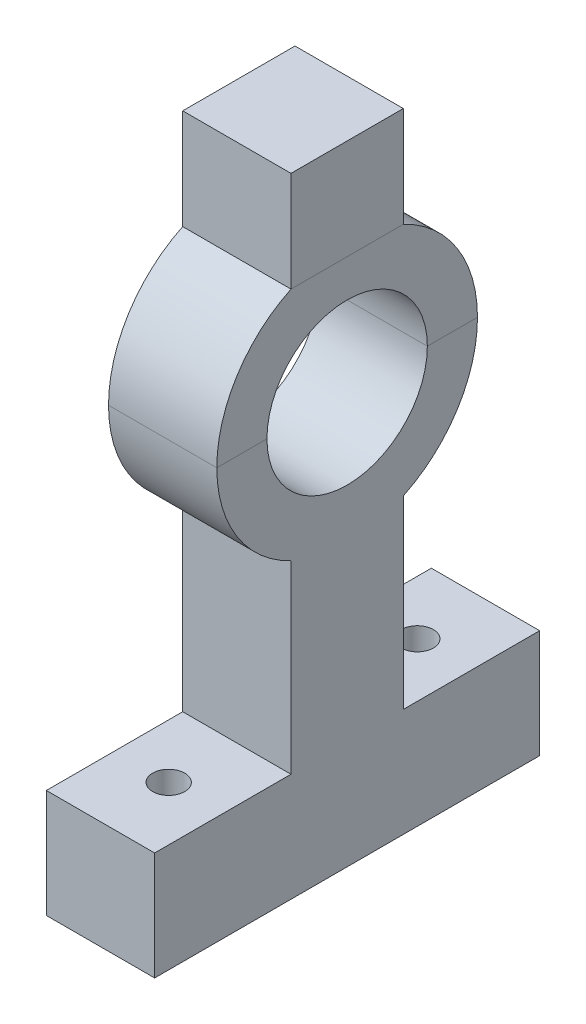
ISO-10303-21;
HEADER;
FILE_DESCRIPTION(('STEP AP214'),'2;1');
FILE_NAME('part.step','',(''),(''),'','','');
FILE_SCHEMA(('AUTOMOTIVE_DESIGN { 1 0 10303 214 1 1 1 1 }'));
ENDSEC;
DATA;
#1=APPLICATION_CONTEXT('core data for automotive mechanical design processes');
#2=APPLICATION_PROTOCOL_DEFINITION('international standard','automotive_design',2000,#1);
#3=PRODUCT_CONTEXT('',#1,'mechanical');
#4=PRODUCT('Part','Part','',(#3));
#5=PRODUCT_RELATED_PRODUCT_CATEGORY('part','',(#4));
#6=PRODUCT_DEFINITION_FORMATION('','',#4);
#7=PRODUCT_DEFINITION_CONTEXT('part definition',#1,'design');
#8=PRODUCT_DEFINITION('design','',#6,#7);
#9=PRODUCT_DEFINITION_SHAPE('','',#8);
#10=(LENGTH_UNIT() NAMED_UNIT(*) SI_UNIT(.MILLI.,.METRE.));
#11=(NAMED_UNIT(*) PLANE_ANGLE_UNIT() SI_UNIT($,.RADIAN.));
#12=(NAMED_UNIT(*) SI_UNIT($,.STERADIAN.) SOLID_ANGLE_UNIT());
#13=UNCERTAINTY_MEASURE_WITH_UNIT(LENGTH_MEASURE(1.E-05),#10,'distance_accuracy_value','');
#14=(GEOMETRIC_REPRESENTATION_CONTEXT(3) GLOBAL_UNCERTAINTY_ASSIGNED_CONTEXT((#13)) GLOBAL_UNIT_ASSIGNED_CONTEXT((#10,
#11,#12)) REPRESENTATION_CONTEXT('',''));
#15=CARTESIAN_POINT('',(0.,0.,0.));
#16=DIRECTION('',(0.,0.,1.));
#17=DIRECTION('',(1.,0.,0.));
#18=AXIS2_PLACEMENT_3D('',#15,#16,#17);
#19=CARTESIAN_POINT('',(27.,95.2100375042499,0.));
#20=DIRECTION('',(0.,1.,0.));
#21=DIRECTION('',(0.,0.,1.));
#22=AXIS2_PLACEMENT_3D('',#19,#20,#21);
#23=PLANE('',#22);
#24=DIRECTION('',(0.,0.,-1.));
#25=VECTOR('',#24,1.);
#26=CARTESIAN_POINT('',(0.,95.2100375042499,0.));
#27=LINE('',#26,#25);
#28=CARTESIAN_POINT('',(0.,95.2100375042499,14.));
#29=VERTEX_POINT('',#28);
#30=CARTESIAN_POINT('',(0.,95.2100375042499,-14.));
#31=VERTEX_POINT('',#30);
#32=EDGE_CURVE('E110',#29,#31,#27,.T.);
#33=ORIENTED_EDGE('',*,*,#32,.T.);
#34=DIRECTION('',(-1.,0.,0.));
#35=VECTOR('',#34,1.);
#36=CARTESIAN_POINT('',(27.,95.2100375042499,-14.));
#37=LINE('',#36,#35);
#38=CARTESIAN_POINT('',(27.,95.2100375042499,-14.));
#39=VERTEX_POINT('',#38);
#40=EDGE_CURVE('E13',#39,#31,#37,.T.);
#41=ORIENTED_EDGE('',*,*,#40,.F.);
#42=DIRECTION('',(0.,0.,-1.));
#43=VECTOR('',#42,1.);
#44=CARTESIAN_POINT('',(27.,95.2100375042499,0.));
#45=LINE('',#44,#43);
#46=CARTESIAN_POINT('',(27.,95.2100375042499,14.));
#47=VERTEX_POINT('',#46);
#48=EDGE_CURVE('E96',#47,#39,#45,.T.);
#49=ORIENTED_EDGE('',*,*,#48,.F.);
#50=DIRECTION('',(-1.,0.,0.));
#51=VECTOR('',#50,1.);
#52=CARTESIAN_POINT('',(27.,95.2100375042499,14.));
#53=LINE('',#52,#51);
#54=EDGE_CURVE('E63',#47,#29,#53,.T.);
#55=ORIENTED_EDGE('',*,*,#54,.T.);
#56=EDGE_LOOP('',(#33,#41,#49,#55));
#57=FACE_BOUND('',#56,.T.);
#58=ADVANCED_FACE('F47',(#57),#23,.F.);
#59=CARTESIAN_POINT('',(27.,0.,-14.));
#60=DIRECTION('',(0.,0.,1.));
#61=DIRECTION('',(0.,-1.,0.));
#62=AXIS2_PLACEMENT_3D('',#59,#60,#61);
#63=PLANE('',#62);
#64=DIRECTION('',(0.,1.,0.));
#65=VECTOR('',#64,1.);
#66=CARTESIAN_POINT('',(0.,0.,-14.));
#67=LINE('',#66,#65);
#68=CARTESIAN_POINT('',(0.,120.21003750425,-14.));
#69=VERTEX_POINT('',#68);
#70=EDGE_CURVE('E101',#31,#69,#67,.T.);
#71=ORIENTED_EDGE('',*,*,#70,.T.);
#72=DIRECTION('',(-1.,0.,0.));
#73=VECTOR('',#72,1.);
#74=CARTESIAN_POINT('',(27.,120.21003750425,-14.));
#75=LINE('',#74,#73);
#76=CARTESIAN_POINT('',(27.,120.21003750425,-14.));
#77=VERTEX_POINT('',#76);
#78=EDGE_CURVE('E55',#77,#69,#75,.T.);
#79=ORIENTED_EDGE('',*,*,#78,.F.);
#80=DIRECTION('',(0.,1.,0.));
#81=VECTOR('',#80,1.);
#82=CARTESIAN_POINT('',(27.,0.,-14.));
#83=LINE('',#82,#81);
#84=EDGE_CURVE('E88',#39,#77,#83,.T.);
#85=ORIENTED_EDGE('',*,*,#84,.F.);
#86=ORIENTED_EDGE('',*,*,#40,.T.);
#87=EDGE_LOOP('',(#71,#79,#85,#86));
#88=FACE_BOUND('',#87,.T.);
#89=ADVANCED_FACE('F100',(#88),#63,.F.);
#90=CARTESIAN_POINT('',(27.,120.21003750425,0.));
#91=DIRECTION('',(0.,1.,0.));
#92=DIRECTION('',(0.,0.,1.));
#93=AXIS2_PLACEMENT_3D('',#90,#91,#92);
#94=PLANE('',#93);
#95=DIRECTION('',(0.,0.,-1.));
#96=VECTOR('',#95,1.);
#97=CARTESIAN_POINT('',(0.,120.21003750425,0.));
#98=LINE('',#97,#96);
#99=CARTESIAN_POINT('',(0.,120.21003750425,14.));
#100=VERTEX_POINT('',#99);
#101=EDGE_CURVE('E113',#100,#69,#98,.T.);
#102=ORIENTED_EDGE('',*,*,#101,.F.);
#103=DIRECTION('',(-1.,0.,0.));
#104=VECTOR('',#103,1.);
#105=CARTESIAN_POINT('',(27.,120.21003750425,14.));
#106=LINE('',#105,#104);
#107=CARTESIAN_POINT('',(27.,120.21003750425,14.));
#108=VERTEX_POINT('',#107);
#109=EDGE_CURVE('E77',#108,#100,#106,.T.);
#110=ORIENTED_EDGE('',*,*,#109,.F.);
#111=DIRECTION('',(0.,0.,-1.));
#112=VECTOR('',#111,1.);
#113=CARTESIAN_POINT('',(27.,120.21003750425,0.));
#114=LINE('',#113,#112);
#115=EDGE_CURVE('E95',#108,#77,#114,.T.);
#116=ORIENTED_EDGE('',*,*,#115,.T.);
#117=ORIENTED_EDGE('',*,*,#78,.T.);
#118=EDGE_LOOP('',(#102,#110,#116,#117));
#119=FACE_BOUND('',#118,.T.);
#120=ADVANCED_FACE('F104',(#119),#94,.T.);
#121=CARTESIAN_POINT('',(27.,0.,14.));
#122=DIRECTION('',(0.,0.,1.));
#123=DIRECTION('',(0.,-1.,0.));
#124=AXIS2_PLACEMENT_3D('',#121,#122,#123);
#125=PLANE('',#124);
#126=DIRECTION('',(0.,1.,0.));
#127=VECTOR('',#126,1.);
#128=CARTESIAN_POINT('',(0.,0.,14.));
#129=LINE('',#128,#127);
#130=EDGE_CURVE('E115',#29,#100,#129,.T.);
#131=ORIENTED_EDGE('',*,*,#130,.F.);
#132=ORIENTED_EDGE('',*,*,#54,.F.);
#133=DIRECTION('',(0.,1.,0.));
#134=VECTOR('',#133,1.);
#135=CARTESIAN_POINT('',(27.,0.,14.));
#136=LINE('',#135,#134);
#137=EDGE_CURVE('E105',#47,#108,#136,.T.);
#138=ORIENTED_EDGE('',*,*,#137,.T.);
#139=ORIENTED_EDGE('',*,*,#109,.T.);
#140=EDGE_LOOP('',(#131,#132,#138,#139));
#141=FACE_BOUND('',#140,.T.);
#142=ADVANCED_FACE('F121',(#141),#125,.T.);
#143=CARTESIAN_POINT('',(27.,0.,0.));
#144=DIRECTION('',(1.,0.,0.));
#145=DIRECTION('',(0.,0.,-1.));
#146=AXIS2_PLACEMENT_3D('',#143,#144,#145);
#147=PLANE('',#146);
#148=ORIENTED_EDGE('',*,*,#48,.T.);
#149=ORIENTED_EDGE('',*,*,#84,.T.);
#150=ORIENTED_EDGE('',*,*,#115,.F.);
#151=ORIENTED_EDGE('',*,*,#137,.F.);
#152=EDGE_LOOP('',(#148,#149,#150,#151));
#153=FACE_BOUND('',#152,.T.);
#154=ADVANCED_FACE('F92',(#153),#147,.T.);
#155=CARTESIAN_POINT('',(0.,0.,0.));
#156=DIRECTION('',(1.,0.,0.));
#157=DIRECTION('',(0.,0.,-1.));
#158=AXIS2_PLACEMENT_3D('',#155,#156,#157);
#159=PLANE('',#158);
#160=ORIENTED_EDGE('',*,*,#32,.F.);
#161=ORIENTED_EDGE('',*,*,#130,.T.);
#162=ORIENTED_EDGE('',*,*,#101,.T.);
#163=ORIENTED_EDGE('',*,*,#70,.F.);
#164=EDGE_LOOP('',(#160,#161,#162,#163));
#165=FACE_BOUND('',#164,.T.);
#166=ADVANCED_FACE('F120',(#165),#159,.F.);
#167=CLOSED_SHELL('',(#58,#89,#120,#142,#154,#166));
#168=MANIFOLD_SOLID_BREP('B2',#167);
#169=CARTESIAN_POINT('',(27.,95.2100375042499,0.));
#170=DIRECTION('',(0.,1.,0.));
#171=DIRECTION('',(0.,0.,1.));
#172=AXIS2_PLACEMENT_3D('',#169,#170,#171);
#173=PLANE('',#172);
#174=DIRECTION('',(0.,0.,-1.));
#175=VECTOR('',#174,1.);
#176=CARTESIAN_POINT('',(0.,95.2100375042499,0.));
#177=LINE('',#176,#175);
#178=CARTESIAN_POINT('',(0.,95.2100375042499,14.));
#179=VERTEX_POINT('',#178);
#180=CARTESIAN_POINT('',(0.,95.2100375042499,-14.));
#181=VERTEX_POINT('',#180);
#182=EDGE_CURVE('E261',#179,#181,#177,.T.);
#183=ORIENTED_EDGE('',*,*,#182,.F.);
#184=DIRECTION('',(-1.,0.,0.));
#185=VECTOR('',#184,1.);
#186=CARTESIAN_POINT('',(27.,95.2100375042499,14.));
#187=LINE('',#186,#185);
#188=CARTESIAN_POINT('',(27.,95.2100375042499,14.));
#189=VERTEX_POINT('',#188);
#190=EDGE_CURVE('E45',#189,#179,#187,.T.);
#191=ORIENTED_EDGE('',*,*,#190,.F.);
#192=DIRECTION('',(0.,0.,-1.));
#193=VECTOR('',#192,1.);
#194=CARTESIAN_POINT('',(27.,95.2100375042499,0.));
#195=LINE('',#194,#193);
#196=CARTESIAN_POINT('',(27.,95.2100375042499,-14.));
#197=VERTEX_POINT('',#196);
#198=EDGE_CURVE('E272',#189,#197,#195,.T.);
#199=ORIENTED_EDGE('',*,*,#198,.T.);
#200=DIRECTION('',(-1.,0.,0.));
#201=VECTOR('',#200,1.);
#202=CARTESIAN_POINT('',(27.,95.2100375042499,-14.));
#203=LINE('',#202,#201);
#204=EDGE_CURVE('E224',#197,#181,#203,.T.);
#205=ORIENTED_EDGE('',*,*,#204,.T.);
#206=EDGE_LOOP('',(#183,#191,#199,#205));
#207=FACE_BOUND('',#206,.T.);
#208=ADVANCED_FACE('F180',(#207),#173,.T.);
#209=CARTESIAN_POINT('',(27.,65.8800187521249,0.));
#210=DIRECTION('',(-1.,0.,0.));
#211=DIRECTION('',(0.,0.,1.));
#212=AXIS2_PLACEMENT_3D('',#209,#210,#211);
#213=CYLINDRICAL_SURFACE('',#212,32.5);
#214=CARTESIAN_POINT('',(0.,65.8800187521249,0.));
#215=DIRECTION('',(1.,0.,0.));
#216=DIRECTION('',(0.,0.,-1.));
#217=AXIS2_PLACEMENT_3D('',#214,#215,#216);
#218=CIRCLE('',#217,32.5);
#219=CARTESIAN_POINT('',(0.,65.8800187521249,32.5));
#220=VERTEX_POINT('',#219);
#221=EDGE_CURVE('E264',#179,#220,#218,.T.);
#222=ORIENTED_EDGE('',*,*,#221,.T.);
#223=DIRECTION('',(-1.,0.,0.));
#224=VECTOR('',#223,1.);
#225=CARTESIAN_POINT('',(27.,65.8800187521249,32.5));
#226=LINE('',#225,#224);
#227=CARTESIAN_POINT('',(27.,65.8800187521249,32.5));
#228=VERTEX_POINT('',#227);
#229=EDGE_CURVE('E188',#228,#220,#226,.T.);
#230=ORIENTED_EDGE('',*,*,#229,.F.);
#231=CARTESIAN_POINT('',(27.,65.8800187521249,0.));
#232=DIRECTION('',(1.,0.,0.));
#233=DIRECTION('',(0.,0.,-1.));
#234=AXIS2_PLACEMENT_3D('',#231,#232,#233);
#235=CIRCLE('',#234,32.5);
#236=EDGE_CURVE('E257',#189,#228,#235,.T.);
#237=ORIENTED_EDGE('',*,*,#236,.F.);
#238=ORIENTED_EDGE('',*,*,#190,.T.);
#239=EDGE_LOOP('',(#222,#230,#237,#238));
#240=FACE_BOUND('',#239,.T.);
#241=ADVANCED_FACE('F288',(#240),#213,.T.);
#242=CARTESIAN_POINT('',(27.,65.8800187521249,0.));
#243=DIRECTION('',(0.,1.,0.));
#244=DIRECTION('',(0.,0.,1.));
#245=AXIS2_PLACEMENT_3D('',#242,#243,#244);
#246=PLANE('',#245);
#247=DIRECTION('',(0.,0.,-1.));
#248=VECTOR('',#247,1.);
#249=CARTESIAN_POINT('',(0.,65.8800187521249,0.));
#250=LINE('',#249,#248);
#251=CARTESIAN_POINT('',(0.,65.8800187521249,20.));
#252=VERTEX_POINT('',#251);
#253=EDGE_CURVE('E266',#220,#252,#250,.T.);
#254=ORIENTED_EDGE('',*,*,#253,.T.);
#255=DIRECTION('',(-1.,0.,0.));
#256=VECTOR('',#255,1.);
#257=CARTESIAN_POINT('',(27.,65.8800187521249,20.));
#258=LINE('',#257,#256);
#259=CARTESIAN_POINT('',(27.,65.8800187521249,20.));
#260=VERTEX_POINT('',#259);
#261=EDGE_CURVE('E246',#260,#252,#258,.T.);
#262=ORIENTED_EDGE('',*,*,#261,.F.);
#263=DIRECTION('',(0.,0.,-1.));
#264=VECTOR('',#263,1.);
#265=CARTESIAN_POINT('',(27.,65.8800187521249,0.));
#266=LINE('',#265,#264);
#267=EDGE_CURVE('E252',#228,#260,#266,.T.);
#268=ORIENTED_EDGE('',*,*,#267,.F.);
#269=ORIENTED_EDGE('',*,*,#229,.T.);
#270=EDGE_LOOP('',(#254,#262,#268,#269));
#271=FACE_BOUND('',#270,.T.);
#272=ADVANCED_FACE('F279',(#271),#246,.F.);
#273=CARTESIAN_POINT('',(27.,65.8800187521249,0.));
#274=DIRECTION('',(-1.,0.,0.));
#275=DIRECTION('',(0.,0.,1.));
#276=AXIS2_PLACEMENT_3D('',#273,#274,#275);
#277=CYLINDRICAL_SURFACE('',#276,20.);
#278=CARTESIAN_POINT('',(0.,65.8800187521249,0.));
#279=DIRECTION('',(1.,0.,0.));
#280=DIRECTION('',(0.,0.,-1.));
#281=AXIS2_PLACEMENT_3D('',#278,#279,#280);
#282=CIRCLE('',#281,20.);
#283=CARTESIAN_POINT('',(0.,65.8800187521249,-20.));
#284=VERTEX_POINT('',#283);
#285=EDGE_CURVE('E245',#284,#252,#282,.T.);
#286=ORIENTED_EDGE('',*,*,#285,.F.);
#287=DIRECTION('',(-1.,0.,0.));
#288=VECTOR('',#287,1.);
#289=CARTESIAN_POINT('',(27.,65.8800187521249,-20.));
#290=LINE('',#289,#288);
#291=CARTESIAN_POINT('',(27.,65.8800187521249,-20.));
#292=VERTEX_POINT('',#291);
#293=EDGE_CURVE('E239',#292,#284,#290,.T.);
#294=ORIENTED_EDGE('',*,*,#293,.F.);
#295=CARTESIAN_POINT('',(27.,65.8800187521249,0.));
#296=DIRECTION('',(1.,0.,0.));
#297=DIRECTION('',(0.,0.,-1.));
#298=AXIS2_PLACEMENT_3D('',#295,#296,#297);
#299=CIRCLE('',#298,20.);
#300=EDGE_CURVE('E243',#292,#260,#299,.T.);
#301=ORIENTED_EDGE('',*,*,#300,.T.);
#302=ORIENTED_EDGE('',*,*,#261,.T.);
#303=EDGE_LOOP('',(#286,#294,#301,#302));
#304=FACE_BOUND('',#303,.T.);
#305=ADVANCED_FACE('F241',(#304),#277,.F.);
#306=CARTESIAN_POINT('',(0.,65.8800187521249,-32.5));
#307=VERTEX_POINT('',#306);
#308=EDGE_CURVE('E217',#284,#307,#250,.T.);
#309=ORIENTED_EDGE('',*,*,#308,.T.);
#310=DIRECTION('',(-1.,0.,0.));
#311=VECTOR('',#310,1.);
#312=CARTESIAN_POINT('',(27.,65.8800187521249,-32.5));
#313=LINE('',#312,#311);
#314=CARTESIAN_POINT('',(27.,65.8800187521249,-32.5));
#315=VERTEX_POINT('',#314);
#316=EDGE_CURVE('E247',#315,#307,#313,.T.);
#317=ORIENTED_EDGE('',*,*,#316,.F.);
#318=EDGE_CURVE('E249',#292,#315,#266,.T.);
#319=ORIENTED_EDGE('',*,*,#318,.F.);
#320=ORIENTED_EDGE('',*,*,#293,.T.);
#321=EDGE_LOOP('',(#309,#317,#319,#320));
#322=FACE_BOUND('',#321,.T.);
#323=ADVANCED_FACE('F250',(#322),#246,.F.);
#324=CARTESIAN_POINT('',(27.,65.8800187521249,0.));
#325=DIRECTION('',(-1.,0.,0.));
#326=DIRECTION('',(0.,0.,1.));
#327=AXIS2_PLACEMENT_3D('',#324,#325,#326);
#328=CYLINDRICAL_SURFACE('',#327,32.5);
#329=CARTESIAN_POINT('',(0.,65.8800187521249,0.));
#330=DIRECTION('',(1.,0.,0.));
#331=DIRECTION('',(0.,0.,-1.));
#332=AXIS2_PLACEMENT_3D('',#329,#330,#331);
#333=CIRCLE('',#332,32.5);
#334=EDGE_CURVE('E270',#307,#181,#333,.T.);
#335=ORIENTED_EDGE('',*,*,#334,.T.);
#336=ORIENTED_EDGE('',*,*,#204,.F.);
#337=CARTESIAN_POINT('',(27.,65.8800187521249,0.));
#338=DIRECTION('',(1.,0.,0.));
#339=DIRECTION('',(0.,0.,-1.));
#340=AXIS2_PLACEMENT_3D('',#337,#338,#339);
#341=CIRCLE('',#340,32.5);
#342=EDGE_CURVE('E196',#315,#197,#341,.T.);
#343=ORIENTED_EDGE('',*,*,#342,.F.);
#344=ORIENTED_EDGE('',*,*,#316,.T.);
#345=EDGE_LOOP('',(#335,#336,#343,#344));
#346=FACE_BOUND('',#345,.T.);
#347=ADVANCED_FACE('F286',(#346),#328,.T.);
#348=CARTESIAN_POINT('',(27.,0.,0.));
#349=DIRECTION('',(1.,0.,0.));
#350=DIRECTION('',(0.,0.,-1.));
#351=AXIS2_PLACEMENT_3D('',#348,#349,#350);
#352=PLANE('',#351);
#353=ORIENTED_EDGE('',*,*,#198,.F.);
#354=ORIENTED_EDGE('',*,*,#236,.T.);
#355=ORIENTED_EDGE('',*,*,#267,.T.);
#356=ORIENTED_EDGE('',*,*,#300,.F.);
#357=ORIENTED_EDGE('',*,*,#318,.T.);
#358=ORIENTED_EDGE('',*,*,#342,.T.);
#359=EDGE_LOOP('',(#353,#354,#355,#356,#357,#358));
#360=FACE_BOUND('',#359,.T.);
#361=ADVANCED_FACE('F253',(#360),#352,.T.);
#362=CARTESIAN_POINT('',(0.,0.,0.));
#363=DIRECTION('',(1.,0.,0.));
#364=DIRECTION('',(0.,0.,-1.));
#365=AXIS2_PLACEMENT_3D('',#362,#363,#364);
#366=PLANE('',#365);
#367=ORIENTED_EDGE('',*,*,#182,.T.);
#368=ORIENTED_EDGE('',*,*,#334,.F.);
#369=ORIENTED_EDGE('',*,*,#308,.F.);
#370=ORIENTED_EDGE('',*,*,#285,.T.);
#371=ORIENTED_EDGE('',*,*,#253,.F.);
#372=ORIENTED_EDGE('',*,*,#221,.F.);
#373=EDGE_LOOP('',(#367,#368,#369,#370,#371,#372));
#374=FACE_BOUND('',#373,.T.);
#375=ADVANCED_FACE('F283',(#374),#366,.F.);
#376=CLOSED_SHELL('',(#208,#241,#272,#305,#323,#347,#361,#375));
#377=MANIFOLD_SOLID_BREP('B7',#376);
#378=CARTESIAN_POINT('',(27.,0.,48.));
#379=DIRECTION('',(0.,0.,1.));
#380=DIRECTION('',(1.,0.,0.));
#381=AXIS2_PLACEMENT_3D('',#378,#379,#380);
#382=PLANE('',#381);
#383=DIRECTION('',(0.,1.,0.));
#384=VECTOR('',#383,1.);
#385=CARTESIAN_POINT('',(0.,0.,48.));
#386=LINE('',#385,#384);
#387=CARTESIAN_POINT('',(0.,-36.55,48.));
#388=VERTEX_POINT('',#387);
#389=CARTESIAN_POINT('',(0.,-9.55000000000001,48.));
#390=VERTEX_POINT('',#389);
#391=EDGE_CURVE('E470',#388,#390,#386,.T.);
#392=ORIENTED_EDGE('',*,*,#391,.F.);
#393=DIRECTION('',(-1.,0.,0.));
#394=VECTOR('',#393,1.);
#395=CARTESIAN_POINT('',(27.,-36.55,48.));
#396=LINE('',#395,#394);
#397=CARTESIAN_POINT('',(27.,-36.55,48.));
#398=VERTEX_POINT('',#397);
#399=EDGE_CURVE('E178',#398,#388,#396,.T.);
#400=ORIENTED_EDGE('',*,*,#399,.F.);
#401=DIRECTION('',(0.,1.,0.));
#402=VECTOR('',#401,1.);
#403=CARTESIAN_POINT('',(27.,0.,48.));
#404=LINE('',#403,#402);
#405=CARTESIAN_POINT('',(27.,-9.55000000000001,48.));
#406=VERTEX_POINT('',#405);
#407=EDGE_CURVE('E500',#398,#406,#404,.T.);
#408=ORIENTED_EDGE('',*,*,#407,.T.);
#409=DIRECTION('',(-1.,0.,0.));
#410=VECTOR('',#409,1.);
#411=CARTESIAN_POINT('',(27.,-9.55000000000001,48.));
#412=LINE('',#411,#410);
#413=EDGE_CURVE('E415',#406,#390,#412,.T.);
#414=ORIENTED_EDGE('',*,*,#413,.T.);
#415=EDGE_LOOP('',(#392,#400,#408,#414));
#416=FACE_BOUND('',#415,.T.);
#417=ADVANCED_FACE('F353',(#416),#382,.T.);
#418=CARTESIAN_POINT('',(27.,-36.55,0.));
#419=DIRECTION('',(0.,-1.,0.));
#420=DIRECTION('',(0.,0.,-1.));
#421=AXIS2_PLACEMENT_3D('',#418,#419,#420);
#422=PLANE('',#421);
#423=CARTESIAN_POINT('',(13.5,-36.55,-31.));
#424=DIRECTION('',(0.,-1.,0.));
#425=DIRECTION('',(0.,0.,-1.));
#426=AXIS2_PLACEMENT_3D('',#423,#424,#425);
#427=CIRCLE('',#426,4.);
#428=CARTESIAN_POINT('',(13.5,-36.55,-35.));
#429=VERTEX_POINT('',#428);
#430=EDGE_CURVE('E595',#429,#429,#427,.T.);
#431=ORIENTED_EDGE('',*,*,#430,.F.);
#432=EDGE_LOOP('',(#431));
#433=FACE_BOUND('',#432,.T.);
#434=CARTESIAN_POINT('',(13.5,-36.55,31.));
#435=DIRECTION('',(0.,1.,0.));
#436=DIRECTION('',(0.,0.,1.));
#437=AXIS2_PLACEMENT_3D('',#434,#435,#436);
#438=CIRCLE('',#437,4.);
#439=CARTESIAN_POINT('',(13.5,-36.55,35.));
#440=VERTEX_POINT('',#439);
#441=EDGE_CURVE('E474',#440,#440,#438,.T.);
#442=ORIENTED_EDGE('',*,*,#441,.T.);
#443=EDGE_LOOP('',(#442));
#444=FACE_BOUND('',#443,.T.);
#445=DIRECTION('',(0.,0.,1.));
#446=VECTOR('',#445,1.);
#447=CARTESIAN_POINT('',(0.,-36.55,0.));
#448=LINE('',#447,#446);
#449=CARTESIAN_POINT('',(0.,-36.55,-48.));
#450=VERTEX_POINT('',#449);
#451=EDGE_CURVE('E473',#450,#388,#448,.T.);
#452=ORIENTED_EDGE('',*,*,#451,.F.);
#453=DIRECTION('',(-1.,0.,0.));
#454=VECTOR('',#453,1.);
#455=CARTESIAN_POINT('',(27.,-36.55,-48.));
#456=LINE('',#455,#454);
#457=CARTESIAN_POINT('',(27.,-36.55,-48.));
#458=VERTEX_POINT('',#457);
#459=EDGE_CURVE('E361',#458,#450,#456,.T.);
#460=ORIENTED_EDGE('',*,*,#459,.F.);
#461=DIRECTION('',(0.,0.,1.));
#462=VECTOR('',#461,1.);
#463=CARTESIAN_POINT('',(27.,-36.55,0.));
#464=LINE('',#463,#462);
#465=EDGE_CURVE('E531',#458,#398,#464,.T.);
#466=ORIENTED_EDGE('',*,*,#465,.T.);
#467=ORIENTED_EDGE('',*,*,#399,.T.);
#468=EDGE_LOOP('',(#452,#460,#466,#467));
#469=FACE_BOUND('',#468,.T.);
#470=ADVANCED_FACE('F530',(#433,#444,#469),#422,.T.);
#471=CARTESIAN_POINT('',(27.,0.,-48.));
#472=DIRECTION('',(0.,0.,1.));
#473=DIRECTION('',(1.,0.,0.));
#474=AXIS2_PLACEMENT_3D('',#471,#472,#473);
#475=PLANE('',#474);
#476=DIRECTION('',(0.,1.,0.));
#477=VECTOR('',#476,1.);
#478=CARTESIAN_POINT('',(0.,0.,-48.));
#479=LINE('',#478,#477);
#480=CARTESIAN_POINT('',(0.,-9.55000000000001,-48.));
#481=VERTEX_POINT('',#480);
#482=EDGE_CURVE('E477',#450,#481,#479,.T.);
#483=ORIENTED_EDGE('',*,*,#482,.T.);
#484=DIRECTION('',(-1.,0.,0.));
#485=VECTOR('',#484,1.);
#486=CARTESIAN_POINT('',(27.,-9.55000000000001,-48.));
#487=LINE('',#486,#485);
#488=CARTESIAN_POINT('',(27.,-9.55000000000001,-48.));
#489=VERTEX_POINT('',#488);
#490=EDGE_CURVE('E515',#489,#481,#487,.T.);
#491=ORIENTED_EDGE('',*,*,#490,.F.);
#492=DIRECTION('',(0.,1.,0.));
#493=VECTOR('',#492,1.);
#494=CARTESIAN_POINT('',(27.,0.,-48.));
#495=LINE('',#494,#493);
#496=EDGE_CURVE('E521',#458,#489,#495,.T.);
#497=ORIENTED_EDGE('',*,*,#496,.F.);
#498=ORIENTED_EDGE('',*,*,#459,.T.);
#499=EDGE_LOOP('',(#483,#491,#497,#498));
#500=FACE_BOUND('',#499,.T.);
#501=ADVANCED_FACE('F519',(#500),#475,.F.);
#502=CARTESIAN_POINT('',(27.,-9.55000000000001,0.));
#503=DIRECTION('',(0.,1.,0.));
#504=DIRECTION('',(0.,0.,1.));
#505=AXIS2_PLACEMENT_3D('',#502,#503,#504);
#506=PLANE('',#505);
#507=CARTESIAN_POINT('',(13.5,-9.55000000000001,-31.));
#508=DIRECTION('',(0.,-1.,0.));
#509=DIRECTION('',(0.,0.,-1.));
#510=AXIS2_PLACEMENT_3D('',#507,#508,#509);
#511=CIRCLE('',#510,4.);
#512=CARTESIAN_POINT('',(13.5,-9.55000000000001,-35.));
#513=VERTEX_POINT('',#512);
#514=EDGE_CURVE('E602',#513,#513,#511,.T.);
#515=ORIENTED_EDGE('',*,*,#514,.T.);
#516=EDGE_LOOP('',(#515));
#517=FACE_BOUND('',#516,.T.);
#518=DIRECTION('',(0.,0.,-1.));
#519=VECTOR('',#518,1.);
#520=CARTESIAN_POINT('',(0.,-9.55000000000001,0.));
#521=LINE('',#520,#519);
#522=CARTESIAN_POINT('',(0.,-9.55000000000001,-14.));
#523=VERTEX_POINT('',#522);
#524=EDGE_CURVE('E480',#523,#481,#521,.T.);
#525=ORIENTED_EDGE('',*,*,#524,.F.);
#526=DIRECTION('',(-1.,0.,0.));
#527=VECTOR('',#526,1.);
#528=CARTESIAN_POINT('',(27.,-9.55000000000001,-14.));
#529=LINE('',#528,#527);
#530=CARTESIAN_POINT('',(27.,-9.55000000000001,-14.));
#531=VERTEX_POINT('',#530);
#532=EDGE_CURVE('E513',#531,#523,#529,.T.);
#533=ORIENTED_EDGE('',*,*,#532,.F.);
#534=DIRECTION('',(0.,0.,-1.));
#535=VECTOR('',#534,1.);
#536=CARTESIAN_POINT('',(27.,-9.55000000000001,0.));
#537=LINE('',#536,#535);
#538=EDGE_CURVE('E540',#531,#489,#537,.T.);
#539=ORIENTED_EDGE('',*,*,#538,.T.);
#540=ORIENTED_EDGE('',*,*,#490,.T.);
#541=EDGE_LOOP('',(#525,#533,#539,#540));
#542=FACE_BOUND('',#541,.T.);
#543=ADVANCED_FACE('F570',(#517,#542),#506,.T.);
#544=CARTESIAN_POINT('',(27.,0.,-14.));
#545=DIRECTION('',(0.,0.,1.));
#546=DIRECTION('',(0.,-1.,0.));
#547=AXIS2_PLACEMENT_3D('',#544,#545,#546);
#548=PLANE('',#547);
#549=DIRECTION('',(0.,1.,0.));
#550=VECTOR('',#549,1.);
#551=CARTESIAN_POINT('',(0.,0.,-14.));
#552=LINE('',#551,#550);
#553=CARTESIAN_POINT('',(0.,36.55,-14.));
#554=VERTEX_POINT('',#553);
#555=EDGE_CURVE('E483',#523,#554,#552,.T.);
#556=ORIENTED_EDGE('',*,*,#555,.T.);
#557=DIRECTION('',(-1.,0.,0.));
#558=VECTOR('',#557,1.);
#559=CARTESIAN_POINT('',(27.,36.55,-14.));
#560=LINE('',#559,#558);
#561=CARTESIAN_POINT('',(27.,36.55,-14.));
#562=VERTEX_POINT('',#561);
#563=EDGE_CURVE('E510',#562,#554,#560,.T.);
#564=ORIENTED_EDGE('',*,*,#563,.F.);
#565=DIRECTION('',(0.,1.,0.));
#566=VECTOR('',#565,1.);
#567=CARTESIAN_POINT('',(27.,0.,-14.));
#568=LINE('',#567,#566);
#569=EDGE_CURVE('E543',#531,#562,#568,.T.);
#570=ORIENTED_EDGE('',*,*,#569,.F.);
#571=ORIENTED_EDGE('',*,*,#532,.T.);
#572=EDGE_LOOP('',(#556,#564,#570,#571));
#573=FACE_BOUND('',#572,.T.);
#574=ADVANCED_FACE('F573',(#573),#548,.F.);
#575=CARTESIAN_POINT('',(27.,65.8800187521249,0.));
#576=DIRECTION('',(-1.,0.,0.));
#577=DIRECTION('',(0.,0.,1.));
#578=AXIS2_PLACEMENT_3D('',#575,#576,#577);
#579=CYLINDRICAL_SURFACE('',#578,32.5);
#580=CARTESIAN_POINT('',(0.,65.8800187521249,0.));
#581=DIRECTION('',(1.,0.,0.));
#582=DIRECTION('',(0.,0.,-1.));
#583=AXIS2_PLACEMENT_3D('',#580,#581,#582);
#584=CIRCLE('',#583,32.5);
#585=CARTESIAN_POINT('',(0.,65.8800187521249,-32.5));
#586=VERTEX_POINT('',#585);
#587=EDGE_CURVE('E485',#554,#586,#584,.T.);
#588=ORIENTED_EDGE('',*,*,#587,.T.);
#589=DIRECTION('',(-1.,0.,0.));
#590=VECTOR('',#589,1.);
#591=CARTESIAN_POINT('',(27.,65.8800187521249,-32.5));
#592=LINE('',#591,#590);
#593=CARTESIAN_POINT('',(27.,65.8800187521249,-32.5));
#594=VERTEX_POINT('',#593);
#595=EDGE_CURVE('E508',#594,#586,#592,.T.);
#596=ORIENTED_EDGE('',*,*,#595,.F.);
#597=CARTESIAN_POINT('',(27.,65.8800187521249,0.));
#598=DIRECTION('',(1.,0.,0.));
#599=DIRECTION('',(0.,0.,-1.));
#600=AXIS2_PLACEMENT_3D('',#597,#598,#599);
#601=CIRCLE('',#600,32.5);
#602=EDGE_CURVE('E545',#562,#594,#601,.T.);
#603=ORIENTED_EDGE('',*,*,#602,.F.);
#604=ORIENTED_EDGE('',*,*,#563,.T.);
#605=EDGE_LOOP('',(#588,#596,#603,#604));
#606=FACE_BOUND('',#605,.T.);
#607=ADVANCED_FACE('F566',(#606),#579,.T.);
#608=CARTESIAN_POINT('',(27.,65.8800187521249,0.));
#609=DIRECTION('',(0.,1.,0.));
#610=DIRECTION('',(0.,0.,1.));
#611=AXIS2_PLACEMENT_3D('',#608,#609,#610);
#612=PLANE('',#611);
#613=DIRECTION('',(0.,0.,-1.));
#614=VECTOR('',#613,1.);
#615=CARTESIAN_POINT('',(0.,65.8800187521249,0.));
#616=LINE('',#615,#614);
#617=CARTESIAN_POINT('',(0.,65.8800187521249,-20.));
#618=VERTEX_POINT('',#617);
#619=EDGE_CURVE('E488',#618,#586,#616,.T.);
#620=ORIENTED_EDGE('',*,*,#619,.F.);
#621=DIRECTION('',(-1.,0.,0.));
#622=VECTOR('',#621,1.);
#623=CARTESIAN_POINT('',(27.,65.8800187521249,-20.));
#624=LINE('',#623,#622);
#625=CARTESIAN_POINT('',(27.,65.8800187521249,-20.));
#626=VERTEX_POINT('',#625);
#627=EDGE_CURVE('E506',#626,#618,#624,.T.);
#628=ORIENTED_EDGE('',*,*,#627,.F.);
#629=DIRECTION('',(0.,0.,-1.));
#630=VECTOR('',#629,1.);
#631=CARTESIAN_POINT('',(27.,65.8800187521249,0.));
#632=LINE('',#631,#630);
#633=EDGE_CURVE('E547',#626,#594,#632,.T.);
#634=ORIENTED_EDGE('',*,*,#633,.T.);
#635=ORIENTED_EDGE('',*,*,#595,.T.);
#636=EDGE_LOOP('',(#620,#628,#634,#635));
#637=FACE_BOUND('',#636,.T.);
#638=ADVANCED_FACE('F562',(#637),#612,.T.);
#639=CARTESIAN_POINT('',(27.,65.8800187521249,0.));
#640=DIRECTION('',(-1.,0.,0.));
#641=DIRECTION('',(0.,0.,1.));
#642=AXIS2_PLACEMENT_3D('',#639,#640,#641);
#643=CYLINDRICAL_SURFACE('',#642,20.);
#644=CARTESIAN_POINT('',(0.,65.8800187521249,0.));
#645=DIRECTION('',(1.,0.,0.));
#646=DIRECTION('',(0.,0.,-1.));
#647=AXIS2_PLACEMENT_3D('',#644,#645,#646);
#648=CIRCLE('',#647,20.);
#649=CARTESIAN_POINT('',(0.,65.8800187521249,20.));
#650=VERTEX_POINT('',#649);
#651=EDGE_CURVE('E491',#650,#618,#648,.T.);
#652=ORIENTED_EDGE('',*,*,#651,.F.);
#653=DIRECTION('',(-1.,0.,0.));
#654=VECTOR('',#653,1.);
#655=CARTESIAN_POINT('',(27.,65.8800187521249,20.));
#656=LINE('',#655,#654);
#657=CARTESIAN_POINT('',(27.,65.8800187521249,20.));
#658=VERTEX_POINT('',#657);
#659=EDGE_CURVE('E504',#658,#650,#656,.T.);
#660=ORIENTED_EDGE('',*,*,#659,.F.);
#661=CARTESIAN_POINT('',(27.,65.8800187521249,0.));
#662=DIRECTION('',(1.,0.,0.));
#663=DIRECTION('',(0.,0.,-1.));
#664=AXIS2_PLACEMENT_3D('',#661,#662,#663);
#665=CIRCLE('',#664,20.);
#666=EDGE_CURVE('E549',#658,#626,#665,.T.);
#667=ORIENTED_EDGE('',*,*,#666,.T.);
#668=ORIENTED_EDGE('',*,*,#627,.T.);
#669=EDGE_LOOP('',(#652,#660,#667,#668));
#670=FACE_BOUND('',#669,.T.);
#671=ADVANCED_FACE('F559',(#670),#643,.F.);
#672=CARTESIAN_POINT('',(0.,65.8800187521249,32.5));
#673=VERTEX_POINT('',#672);
#674=EDGE_CURVE('E492',#673,#650,#616,.T.);
#675=ORIENTED_EDGE('',*,*,#674,.F.);
#676=DIRECTION('',(-1.,0.,0.));
#677=VECTOR('',#676,1.);
#678=CARTESIAN_POINT('',(27.,65.8800187521249,32.5));
#679=LINE('',#678,#677);
#680=CARTESIAN_POINT('',(27.,65.8800187521249,32.5));
#681=VERTEX_POINT('',#680);
#682=EDGE_CURVE('E463',#681,#673,#679,.T.);
#683=ORIENTED_EDGE('',*,*,#682,.F.);
#684=EDGE_CURVE('E452',#681,#658,#632,.T.);
#685=ORIENTED_EDGE('',*,*,#684,.T.);
#686=ORIENTED_EDGE('',*,*,#659,.T.);
#687=EDGE_LOOP('',(#675,#683,#685,#686));
#688=FACE_BOUND('',#687,.T.);
#689=ADVANCED_FACE('F554',(#688),#612,.T.);
#690=CARTESIAN_POINT('',(27.,65.8800187521249,0.));
#691=DIRECTION('',(-1.,0.,0.));
#692=DIRECTION('',(0.,0.,1.));
#693=AXIS2_PLACEMENT_3D('',#690,#691,#692);
#694=CYLINDRICAL_SURFACE('',#693,32.5);
#695=CARTESIAN_POINT('',(0.,65.8800187521249,0.));
#696=DIRECTION('',(1.,0.,0.));
#697=DIRECTION('',(0.,0.,-1.));
#698=AXIS2_PLACEMENT_3D('',#695,#696,#697);
#699=CIRCLE('',#698,32.5);
#700=CARTESIAN_POINT('',(0.,36.55,14.));
#701=VERTEX_POINT('',#700);
#702=EDGE_CURVE('E459',#673,#701,#699,.T.);
#703=ORIENTED_EDGE('',*,*,#702,.T.);
#704=DIRECTION('',(-1.,0.,0.));
#705=VECTOR('',#704,1.);
#706=CARTESIAN_POINT('',(27.,36.55,14.));
#707=LINE('',#706,#705);
#708=CARTESIAN_POINT('',(27.,36.55,14.));
#709=VERTEX_POINT('',#708);
#710=EDGE_CURVE('E456',#709,#701,#707,.T.);
#711=ORIENTED_EDGE('',*,*,#710,.F.);
#712=CARTESIAN_POINT('',(27.,65.8800187521249,0.));
#713=DIRECTION('',(1.,0.,0.));
#714=DIRECTION('',(0.,0.,-1.));
#715=AXIS2_PLACEMENT_3D('',#712,#713,#714);
#716=CIRCLE('',#715,32.5);
#717=EDGE_CURVE('E445',#681,#709,#716,.T.);
#718=ORIENTED_EDGE('',*,*,#717,.F.);
#719=ORIENTED_EDGE('',*,*,#682,.T.);
#720=EDGE_LOOP('',(#703,#711,#718,#719));
#721=FACE_BOUND('',#720,.T.);
#722=ADVANCED_FACE('F457',(#721),#694,.T.);
#723=CARTESIAN_POINT('',(27.,0.,14.));
#724=DIRECTION('',(0.,0.,1.));
#725=DIRECTION('',(0.,-1.,0.));
#726=AXIS2_PLACEMENT_3D('',#723,#724,#725);
#727=PLANE('',#726);
#728=DIRECTION('',(0.,1.,0.));
#729=VECTOR('',#728,1.);
#730=CARTESIAN_POINT('',(0.,0.,14.));
#731=LINE('',#730,#729);
#732=CARTESIAN_POINT('',(0.,-9.55000000000001,14.));
#733=VERTEX_POINT('',#732);
#734=EDGE_CURVE('E496',#733,#701,#731,.T.);
#735=ORIENTED_EDGE('',*,*,#734,.F.);
#736=DIRECTION('',(-1.,0.,0.));
#737=VECTOR('',#736,1.);
#738=CARTESIAN_POINT('',(27.,-9.55000000000001,14.));
#739=LINE('',#738,#737);
#740=CARTESIAN_POINT('',(27.,-9.55000000000001,14.));
#741=VERTEX_POINT('',#740);
#742=EDGE_CURVE('E408',#741,#733,#739,.T.);
#743=ORIENTED_EDGE('',*,*,#742,.F.);
#744=DIRECTION('',(0.,1.,0.));
#745=VECTOR('',#744,1.);
#746=CARTESIAN_POINT('',(27.,0.,14.));
#747=LINE('',#746,#745);
#748=EDGE_CURVE('E449',#741,#709,#747,.T.);
#749=ORIENTED_EDGE('',*,*,#748,.T.);
#750=ORIENTED_EDGE('',*,*,#710,.T.);
#751=EDGE_LOOP('',(#735,#743,#749,#750));
#752=FACE_BOUND('',#751,.T.);
#753=ADVANCED_FACE('F465',(#752),#727,.T.);
#754=CARTESIAN_POINT('',(27.,-9.55000000000001,0.));
#755=DIRECTION('',(0.,-1.,0.));
#756=DIRECTION('',(0.,0.,-1.));
#757=AXIS2_PLACEMENT_3D('',#754,#755,#756);
#758=PLANE('',#757);
#759=CARTESIAN_POINT('',(13.5,-9.55000000000001,31.));
#760=DIRECTION('',(0.,1.,0.));
#761=DIRECTION('',(0.,0.,1.));
#762=AXIS2_PLACEMENT_3D('',#759,#760,#761);
#763=CIRCLE('',#762,4.);
#764=CARTESIAN_POINT('',(13.5,-9.55000000000001,35.));
#765=VERTEX_POINT('',#764);
#766=EDGE_CURVE('E536',#765,#765,#763,.T.);
#767=ORIENTED_EDGE('',*,*,#766,.F.);
#768=EDGE_LOOP('',(#767));
#769=FACE_BOUND('',#768,.T.);
#770=DIRECTION('',(0.,0.,1.));
#771=VECTOR('',#770,1.);
#772=CARTESIAN_POINT('',(0.,-9.55000000000001,0.));
#773=LINE('',#772,#771);
#774=EDGE_CURVE('E498',#733,#390,#773,.T.);
#775=ORIENTED_EDGE('',*,*,#774,.T.);
#776=ORIENTED_EDGE('',*,*,#413,.F.);
#777=DIRECTION('',(0.,0.,1.));
#778=VECTOR('',#777,1.);
#779=CARTESIAN_POINT('',(27.,-9.55000000000001,0.));
#780=LINE('',#779,#778);
#781=EDGE_CURVE('E369',#741,#406,#780,.T.);
#782=ORIENTED_EDGE('',*,*,#781,.F.);
#783=ORIENTED_EDGE('',*,*,#742,.T.);
#784=EDGE_LOOP('',(#775,#776,#782,#783));
#785=FACE_BOUND('',#784,.T.);
#786=ADVANCED_FACE('F532',(#769,#785),#758,.F.);
#787=CARTESIAN_POINT('',(27.,0.,0.));
#788=DIRECTION('',(1.,0.,0.));
#789=DIRECTION('',(0.,0.,-1.));
#790=AXIS2_PLACEMENT_3D('',#787,#788,#789);
#791=PLANE('',#790);
#792=ORIENTED_EDGE('',*,*,#407,.F.);
#793=ORIENTED_EDGE('',*,*,#465,.F.);
#794=ORIENTED_EDGE('',*,*,#496,.T.);
#795=ORIENTED_EDGE('',*,*,#538,.F.);
#796=ORIENTED_EDGE('',*,*,#569,.T.);
#797=ORIENTED_EDGE('',*,*,#602,.T.);
#798=ORIENTED_EDGE('',*,*,#633,.F.);
#799=ORIENTED_EDGE('',*,*,#666,.F.);
#800=ORIENTED_EDGE('',*,*,#684,.F.);
#801=ORIENTED_EDGE('',*,*,#717,.T.);
#802=ORIENTED_EDGE('',*,*,#748,.F.);
#803=ORIENTED_EDGE('',*,*,#781,.T.);
#804=EDGE_LOOP('',(#792,#793,#794,#795,#796,#797,#798,#799,#800,#801,#802,#803));
#805=FACE_BOUND('',#804,.T.);
#806=ADVANCED_FACE('F447',(#805),#791,.T.);
#807=CARTESIAN_POINT('',(0.,0.,0.));
#808=DIRECTION('',(1.,0.,0.));
#809=DIRECTION('',(0.,0.,-1.));
#810=AXIS2_PLACEMENT_3D('',#807,#808,#809);
#811=PLANE('',#810);
#812=ORIENTED_EDGE('',*,*,#391,.T.);
#813=ORIENTED_EDGE('',*,*,#774,.F.);
#814=ORIENTED_EDGE('',*,*,#734,.T.);
#815=ORIENTED_EDGE('',*,*,#702,.F.);
#816=ORIENTED_EDGE('',*,*,#674,.T.);
#817=ORIENTED_EDGE('',*,*,#651,.T.);
#818=ORIENTED_EDGE('',*,*,#619,.T.);
#819=ORIENTED_EDGE('',*,*,#587,.F.);
#820=ORIENTED_EDGE('',*,*,#555,.F.);
#821=ORIENTED_EDGE('',*,*,#524,.T.);
#822=ORIENTED_EDGE('',*,*,#482,.F.);
#823=ORIENTED_EDGE('',*,*,#451,.T.);
#824=EDGE_LOOP('',(#812,#813,#814,#815,#816,#817,#818,#819,#820,#821,#822,#823));
#825=FACE_BOUND('',#824,.T.);
#826=ADVANCED_FACE('F527',(#825),#811,.F.);
#827=CARTESIAN_POINT('',(13.5,-36.55,31.));
#828=DIRECTION('',(0.,1.,0.));
#829=DIRECTION('',(0.,0.,1.));
#830=AXIS2_PLACEMENT_3D('',#827,#828,#829);
#831=CYLINDRICAL_SURFACE('',#830,4.);
#832=ORIENTED_EDGE('',*,*,#441,.F.);
#833=EDGE_LOOP('',(#832));
#834=FACE_BOUND('',#833,.T.);
#835=ORIENTED_EDGE('',*,*,#766,.T.);
#836=EDGE_LOOP('',(#835));
#837=FACE_BOUND('',#836,.T.);
#838=ADVANCED_FACE('F609',(#834,#837),#831,.F.);
#839=CARTESIAN_POINT('',(13.5,-9.55000000000001,-31.));
#840=DIRECTION('',(0.,-1.,0.));
#841=DIRECTION('',(0.,0.,-1.));
#842=AXIS2_PLACEMENT_3D('',#839,#840,#841);
#843=CYLINDRICAL_SURFACE('',#842,4.);
#844=ORIENTED_EDGE('',*,*,#514,.F.);
#845=EDGE_LOOP('',(#844));
#846=FACE_BOUND('',#845,.T.);
#847=ORIENTED_EDGE('',*,*,#430,.T.);
#848=EDGE_LOOP('',(#847));
#849=FACE_BOUND('',#848,.T.);
#850=ADVANCED_FACE('F606',(#846,#849),#843,.F.);
#851=CLOSED_SHELL('',(#417,#470,#501,#543,#574,#607,#638,#671,#689,#722,#753,#786,#806,#826,
#838,#850));
#852=MANIFOLD_SOLID_BREP('B39',#851);
#853=ADVANCED_BREP_SHAPE_REPRESENTATION('',(#18,#168,#377,#852),#14);
#854=SHAPE_DEFINITION_REPRESENTATION(#9,#853);
ENDSEC;
END-ISO-10303-21;
